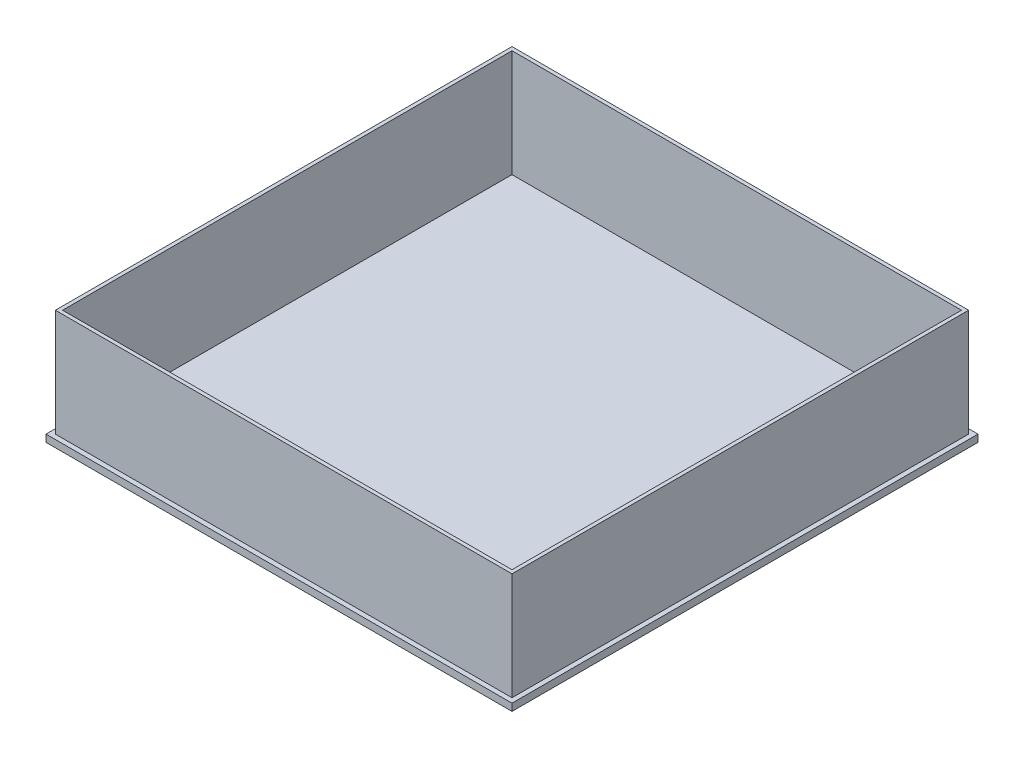
ISO-10303-21;
HEADER;
FILE_DESCRIPTION(('STEP AP214'),'2;1');
FILE_NAME('part.step','',(''),(''),'','','');
FILE_SCHEMA(('AUTOMOTIVE_DESIGN { 1 0 10303 214 1 1 1 1 }'));
ENDSEC;
DATA;
#1=APPLICATION_CONTEXT('core data for automotive mechanical design processes');
#2=APPLICATION_PROTOCOL_DEFINITION('international standard','automotive_design',2000,#1);
#3=PRODUCT_CONTEXT('',#1,'mechanical');
#4=PRODUCT('Part','Part','',(#3));
#5=PRODUCT_RELATED_PRODUCT_CATEGORY('part','',(#4));
#6=PRODUCT_DEFINITION_FORMATION('','',#4);
#7=PRODUCT_DEFINITION_CONTEXT('part definition',#1,'design');
#8=PRODUCT_DEFINITION('design','',#6,#7);
#9=PRODUCT_DEFINITION_SHAPE('','',#8);
#10=(LENGTH_UNIT() NAMED_UNIT(*) SI_UNIT(.MILLI.,.METRE.));
#11=(NAMED_UNIT(*) PLANE_ANGLE_UNIT() SI_UNIT($,.RADIAN.));
#12=(NAMED_UNIT(*) SI_UNIT($,.STERADIAN.) SOLID_ANGLE_UNIT());
#13=UNCERTAINTY_MEASURE_WITH_UNIT(LENGTH_MEASURE(1.E-05),#10,'distance_accuracy_value','');
#14=(GEOMETRIC_REPRESENTATION_CONTEXT(3) GLOBAL_UNCERTAINTY_ASSIGNED_CONTEXT((#13)) GLOBAL_UNIT_ASSIGNED_CONTEXT((#10,
#11,#12)) REPRESENTATION_CONTEXT('',''));
#15=CARTESIAN_POINT('',(0.,0.,0.));
#16=DIRECTION('',(0.,0.,1.));
#17=DIRECTION('',(1.,0.,0.));
#18=AXIS2_PLACEMENT_3D('',#15,#16,#17);
#19=CARTESIAN_POINT('',(0.,2.,0.));
#20=DIRECTION('',(0.,1.,0.));
#21=DIRECTION('',(0.,0.,1.));
#22=AXIS2_PLACEMENT_3D('',#19,#20,#21);
#23=PLANE('',#22);
#24=DIRECTION('',(0.,0.,1.));
#25=VECTOR('',#24,1.);
#26=CARTESIAN_POINT('',(-65.135852994836,2.,65.1358529948359));
#27=LINE('',#26,#25);
#28=CARTESIAN_POINT('',(-65.135852994836,2.,-65.1358529948359));
#29=VERTEX_POINT('',#28);
#30=CARTESIAN_POINT('',(-65.135852994836,2.,65.1358529948359));
#31=VERTEX_POINT('',#30);
#32=EDGE_CURVE('E190',#29,#31,#27,.T.);
#33=ORIENTED_EDGE('',*,*,#32,.T.);
#34=DIRECTION('',(1.,0.,0.));
#35=VECTOR('',#34,1.);
#36=CARTESIAN_POINT('',(65.135852994836,2.,65.1358529948359));
#37=LINE('',#36,#35);
#38=CARTESIAN_POINT('',(65.135852994836,2.,65.1358529948359));
#39=VERTEX_POINT('',#38);
#40=EDGE_CURVE('E193',#31,#39,#37,.T.);
#41=ORIENTED_EDGE('',*,*,#40,.T.);
#42=DIRECTION('',(0.,0.,-1.));
#43=VECTOR('',#42,1.);
#44=CARTESIAN_POINT('',(65.135852994836,2.,65.1358529948359));
#45=LINE('',#44,#43);
#46=CARTESIAN_POINT('',(65.135852994836,2.,-65.1358529948359));
#47=VERTEX_POINT('',#46);
#48=EDGE_CURVE('E196',#39,#47,#45,.T.);
#49=ORIENTED_EDGE('',*,*,#48,.T.);
#50=DIRECTION('',(-1.,0.,0.));
#51=VECTOR('',#50,1.);
#52=CARTESIAN_POINT('',(65.135852994836,2.,-65.1358529948359));
#53=LINE('',#52,#51);
#54=EDGE_CURVE('E198',#47,#29,#53,.T.);
#55=ORIENTED_EDGE('',*,*,#54,.T.);
#56=EDGE_LOOP('',(#33,#41,#49,#55));
#57=FACE_BOUND('',#56,.T.);
#58=DIRECTION('',(-1.,0.,0.));
#59=VECTOR('',#58,1.);
#60=CARTESIAN_POINT('',(-63.8241885978652,2.,-63.8241885978652));
#61=LINE('',#60,#59);
#62=CARTESIAN_POINT('',(63.8241885978652,2.,-63.8241885978652));
#63=VERTEX_POINT('',#62);
#64=CARTESIAN_POINT('',(-63.8241885978652,2.,-63.8241885978652));
#65=VERTEX_POINT('',#64);
#66=EDGE_CURVE('E176',#63,#65,#61,.T.);
#67=ORIENTED_EDGE('',*,*,#66,.F.);
#68=DIRECTION('',(0.,0.,-1.));
#69=VECTOR('',#68,1.);
#70=CARTESIAN_POINT('',(63.8241885978652,2.,63.8241885978652));
#71=LINE('',#70,#69);
#72=CARTESIAN_POINT('',(63.8241885978652,2.,63.8241885978652));
#73=VERTEX_POINT('',#72);
#74=EDGE_CURVE('E141',#73,#63,#71,.T.);
#75=ORIENTED_EDGE('',*,*,#74,.F.);
#76=DIRECTION('',(1.,0.,0.));
#77=VECTOR('',#76,1.);
#78=CARTESIAN_POINT('',(-63.8241885978652,2.,63.8241885978652));
#79=LINE('',#78,#77);
#80=CARTESIAN_POINT('',(-63.8241885978652,2.,63.8241885978652));
#81=VERTEX_POINT('',#80);
#82=EDGE_CURVE('E167',#81,#73,#79,.T.);
#83=ORIENTED_EDGE('',*,*,#82,.F.);
#84=DIRECTION('',(0.,0.,1.));
#85=VECTOR('',#84,1.);
#86=CARTESIAN_POINT('',(-63.8241885978652,2.,63.8241885978652));
#87=LINE('',#86,#85);
#88=EDGE_CURVE('E178',#65,#81,#87,.T.);
#89=ORIENTED_EDGE('',*,*,#88,.F.);
#90=EDGE_LOOP('',(#67,#75,#83,#89));
#91=FACE_BOUND('',#90,.T.);
#92=ADVANCED_FACE('F33',(#57,#91),#23,.T.);
#93=CARTESIAN_POINT('',(-65.135852994836,2.,65.1358529948359));
#94=DIRECTION('',(1.,0.,0.));
#95=DIRECTION('',(0.,0.,-1.));
#96=AXIS2_PLACEMENT_3D('',#93,#94,#95);
#97=PLANE('',#96);
#98=DIRECTION('',(0.,0.,1.));
#99=VECTOR('',#98,1.);
#100=CARTESIAN_POINT('',(-65.135852994836,0.,65.1358529948359));
#101=LINE('',#100,#99);
#102=CARTESIAN_POINT('',(-65.135852994836,0.,-65.1358529948359));
#103=VERTEX_POINT('',#102);
#104=CARTESIAN_POINT('',(-65.135852994836,0.,65.1358529948359));
#105=VERTEX_POINT('',#104);
#106=EDGE_CURVE('E189',#103,#105,#101,.T.);
#107=ORIENTED_EDGE('',*,*,#106,.T.);
#108=DIRECTION('',(0.,-1.,0.));
#109=VECTOR('',#108,1.);
#110=CARTESIAN_POINT('',(-65.135852994836,2.,65.1358529948359));
#111=LINE('',#110,#109);
#112=EDGE_CURVE('E11',#31,#105,#111,.T.);
#113=ORIENTED_EDGE('',*,*,#112,.F.);
#114=ORIENTED_EDGE('',*,*,#32,.F.);
#115=DIRECTION('',(0.,-1.,0.));
#116=VECTOR('',#115,1.);
#117=CARTESIAN_POINT('',(-65.135852994836,2.,-65.1358529948359));
#118=LINE('',#117,#116);
#119=EDGE_CURVE('E200',#29,#103,#118,.T.);
#120=ORIENTED_EDGE('',*,*,#119,.T.);
#121=EDGE_LOOP('',(#107,#113,#114,#120));
#122=FACE_BOUND('',#121,.T.);
#123=ADVANCED_FACE('F35',(#122),#97,.F.);
#124=CARTESIAN_POINT('',(65.135852994836,2.,65.1358529948359));
#125=DIRECTION('',(0.,0.,-1.));
#126=DIRECTION('',(-1.,0.,0.));
#127=AXIS2_PLACEMENT_3D('',#124,#125,#126);
#128=PLANE('',#127);
#129=DIRECTION('',(1.,0.,0.));
#130=VECTOR('',#129,1.);
#131=CARTESIAN_POINT('',(65.135852994836,0.,65.1358529948359));
#132=LINE('',#131,#130);
#133=CARTESIAN_POINT('',(65.135852994836,0.,65.1358529948359));
#134=VERTEX_POINT('',#133);
#135=EDGE_CURVE('E203',#105,#134,#132,.T.);
#136=ORIENTED_EDGE('',*,*,#135,.T.);
#137=DIRECTION('',(0.,-1.,0.));
#138=VECTOR('',#137,1.);
#139=CARTESIAN_POINT('',(65.135852994836,2.,65.1358529948359));
#140=LINE('',#139,#138);
#141=EDGE_CURVE('E41',#39,#134,#140,.T.);
#142=ORIENTED_EDGE('',*,*,#141,.F.);
#143=ORIENTED_EDGE('',*,*,#40,.F.);
#144=ORIENTED_EDGE('',*,*,#112,.T.);
#145=EDGE_LOOP('',(#136,#142,#143,#144));
#146=FACE_BOUND('',#145,.T.);
#147=ADVANCED_FACE('F233',(#146),#128,.F.);
#148=CARTESIAN_POINT('',(65.135852994836,2.,65.1358529948359));
#149=DIRECTION('',(-1.,0.,0.));
#150=DIRECTION('',(0.,0.,1.));
#151=AXIS2_PLACEMENT_3D('',#148,#149,#150);
#152=PLANE('',#151);
#153=DIRECTION('',(0.,0.,-1.));
#154=VECTOR('',#153,1.);
#155=CARTESIAN_POINT('',(65.135852994836,0.,65.1358529948359));
#156=LINE('',#155,#154);
#157=CARTESIAN_POINT('',(65.135852994836,0.,-65.1358529948359));
#158=VERTEX_POINT('',#157);
#159=EDGE_CURVE('E205',#134,#158,#156,.T.);
#160=ORIENTED_EDGE('',*,*,#159,.T.);
#161=DIRECTION('',(0.,-1.,0.));
#162=VECTOR('',#161,1.);
#163=CARTESIAN_POINT('',(65.135852994836,2.,-65.1358529948359));
#164=LINE('',#163,#162);
#165=EDGE_CURVE('E210',#47,#158,#164,.T.);
#166=ORIENTED_EDGE('',*,*,#165,.F.);
#167=ORIENTED_EDGE('',*,*,#48,.F.);
#168=ORIENTED_EDGE('',*,*,#141,.T.);
#169=EDGE_LOOP('',(#160,#166,#167,#168));
#170=FACE_BOUND('',#169,.T.);
#171=ADVANCED_FACE('F217',(#170),#152,.F.);
#172=CARTESIAN_POINT('',(65.135852994836,2.,-65.1358529948359));
#173=DIRECTION('',(0.,0.,1.));
#174=DIRECTION('',(1.,0.,0.));
#175=AXIS2_PLACEMENT_3D('',#172,#173,#174);
#176=PLANE('',#175);
#177=DIRECTION('',(-1.,0.,0.));
#178=VECTOR('',#177,1.);
#179=CARTESIAN_POINT('',(65.135852994836,0.,-65.1358529948359));
#180=LINE('',#179,#178);
#181=EDGE_CURVE('E194',#158,#103,#180,.T.);
#182=ORIENTED_EDGE('',*,*,#181,.T.);
#183=ORIENTED_EDGE('',*,*,#119,.F.);
#184=ORIENTED_EDGE('',*,*,#54,.F.);
#185=ORIENTED_EDGE('',*,*,#165,.T.);
#186=EDGE_LOOP('',(#182,#183,#184,#185));
#187=FACE_BOUND('',#186,.T.);
#188=ADVANCED_FACE('F226',(#187),#176,.F.);
#189=CARTESIAN_POINT('',(0.,0.,0.));
#190=DIRECTION('',(0.,1.,0.));
#191=DIRECTION('',(0.,0.,1.));
#192=AXIS2_PLACEMENT_3D('',#189,#190,#191);
#193=PLANE('',#192);
#194=ORIENTED_EDGE('',*,*,#106,.F.);
#195=ORIENTED_EDGE('',*,*,#181,.F.);
#196=ORIENTED_EDGE('',*,*,#159,.F.);
#197=ORIENTED_EDGE('',*,*,#135,.F.);
#198=EDGE_LOOP('',(#194,#195,#196,#197));
#199=FACE_BOUND('',#198,.T.);
#200=ADVANCED_FACE('F223',(#199),#193,.F.);
#201=CARTESIAN_POINT('',(0.,32.,0.));
#202=DIRECTION('',(0.,-1.,0.));
#203=DIRECTION('',(0.,0.,-1.));
#204=AXIS2_PLACEMENT_3D('',#201,#202,#203);
#205=PLANE('',#204);
#206=DIRECTION('',(0.,0.,-1.));
#207=VECTOR('',#206,1.);
#208=CARTESIAN_POINT('',(63.8241885978652,32.,63.8241885978652));
#209=LINE('',#208,#207);
#210=CARTESIAN_POINT('',(63.8241885978652,32.,63.8241885978652));
#211=VERTEX_POINT('',#210);
#212=CARTESIAN_POINT('',(63.8241885978652,32.,-63.8241885978652));
#213=VERTEX_POINT('',#212);
#214=EDGE_CURVE('E163',#211,#213,#209,.T.);
#215=ORIENTED_EDGE('',*,*,#214,.T.);
#216=DIRECTION('',(-1.,0.,0.));
#217=VECTOR('',#216,1.);
#218=CARTESIAN_POINT('',(-63.8241885978652,32.,-63.8241885978652));
#219=LINE('',#218,#217);
#220=CARTESIAN_POINT('',(-63.8241885978652,32.,-63.8241885978652));
#221=VERTEX_POINT('',#220);
#222=EDGE_CURVE('E166',#213,#221,#219,.T.);
#223=ORIENTED_EDGE('',*,*,#222,.T.);
#224=DIRECTION('',(0.,0.,1.));
#225=VECTOR('',#224,1.);
#226=CARTESIAN_POINT('',(-63.8241885978652,32.,63.8241885978652));
#227=LINE('',#226,#225);
#228=CARTESIAN_POINT('',(-63.8241885978652,32.,63.8241885978652));
#229=VERTEX_POINT('',#228);
#230=EDGE_CURVE('E169',#221,#229,#227,.T.);
#231=ORIENTED_EDGE('',*,*,#230,.T.);
#232=DIRECTION('',(1.,0.,0.));
#233=VECTOR('',#232,1.);
#234=CARTESIAN_POINT('',(-63.8241885978652,32.,63.8241885978652));
#235=LINE('',#234,#233);
#236=EDGE_CURVE('E171',#229,#211,#235,.T.);
#237=ORIENTED_EDGE('',*,*,#236,.T.);
#238=EDGE_LOOP('',(#215,#223,#231,#237));
#239=FACE_BOUND('',#238,.T.);
#240=DIRECTION('',(0.,0.,1.));
#241=VECTOR('',#240,1.);
#242=CARTESIAN_POINT('',(-62.8241885978652,32.,62.8241885978652));
#243=LINE('',#242,#241);
#244=CARTESIAN_POINT('',(-62.8241885978652,32.,-62.8241885978652));
#245=VERTEX_POINT('',#244);
#246=CARTESIAN_POINT('',(-62.8241885978652,32.,62.8241885978652));
#247=VERTEX_POINT('',#246);
#248=EDGE_CURVE('E124',#245,#247,#243,.T.);
#249=ORIENTED_EDGE('',*,*,#248,.F.);
#250=DIRECTION('',(-1.,0.,0.));
#251=VECTOR('',#250,1.);
#252=CARTESIAN_POINT('',(-62.8241885978652,32.,-62.8241885978652));
#253=LINE('',#252,#251);
#254=CARTESIAN_POINT('',(62.8241885978652,32.,-62.8241885978652));
#255=VERTEX_POINT('',#254);
#256=EDGE_CURVE('E149',#255,#245,#253,.T.);
#257=ORIENTED_EDGE('',*,*,#256,.F.);
#258=DIRECTION('',(0.,0.,-1.));
#259=VECTOR('',#258,1.);
#260=CARTESIAN_POINT('',(62.8241885978652,32.,62.8241885978652));
#261=LINE('',#260,#259);
#262=CARTESIAN_POINT('',(62.8241885978652,32.,62.8241885978652));
#263=VERTEX_POINT('',#262);
#264=EDGE_CURVE('E147',#263,#255,#261,.T.);
#265=ORIENTED_EDGE('',*,*,#264,.F.);
#266=DIRECTION('',(1.,0.,0.));
#267=VECTOR('',#266,1.);
#268=CARTESIAN_POINT('',(-62.8241885978652,32.,62.8241885978652));
#269=LINE('',#268,#267);
#270=EDGE_CURVE('E133',#247,#263,#269,.T.);
#271=ORIENTED_EDGE('',*,*,#270,.F.);
#272=EDGE_LOOP('',(#249,#257,#265,#271));
#273=FACE_BOUND('',#272,.T.);
#274=ADVANCED_FACE('F145',(#239,#273),#205,.F.);
#275=CARTESIAN_POINT('',(63.8241885978652,32.,63.8241885978652));
#276=DIRECTION('',(-1.,0.,0.));
#277=DIRECTION('',(0.,0.,1.));
#278=AXIS2_PLACEMENT_3D('',#275,#276,#277);
#279=PLANE('',#278);
#280=ORIENTED_EDGE('',*,*,#74,.T.);
#281=DIRECTION('',(0.,-1.,0.));
#282=VECTOR('',#281,1.);
#283=CARTESIAN_POINT('',(63.8241885978652,32.,-63.8241885978652));
#284=LINE('',#283,#282);
#285=EDGE_CURVE('E187',#213,#63,#284,.T.);
#286=ORIENTED_EDGE('',*,*,#285,.F.);
#287=ORIENTED_EDGE('',*,*,#214,.F.);
#288=DIRECTION('',(0.,-1.,0.));
#289=VECTOR('',#288,1.);
#290=CARTESIAN_POINT('',(63.8241885978652,32.,63.8241885978652));
#291=LINE('',#290,#289);
#292=EDGE_CURVE('E173',#211,#73,#291,.T.);
#293=ORIENTED_EDGE('',*,*,#292,.T.);
#294=EDGE_LOOP('',(#280,#286,#287,#293));
#295=FACE_BOUND('',#294,.T.);
#296=ADVANCED_FACE('F269',(#295),#279,.F.);
#297=CARTESIAN_POINT('',(-63.8241885978652,32.,-63.8241885978652));
#298=DIRECTION('',(0.,0.,1.));
#299=DIRECTION('',(1.,0.,0.));
#300=AXIS2_PLACEMENT_3D('',#297,#298,#299);
#301=PLANE('',#300);
#302=ORIENTED_EDGE('',*,*,#66,.T.);
#303=DIRECTION('',(0.,-1.,0.));
#304=VECTOR('',#303,1.);
#305=CARTESIAN_POINT('',(-63.8241885978652,32.,-63.8241885978652));
#306=LINE('',#305,#304);
#307=EDGE_CURVE('E184',#221,#65,#306,.T.);
#308=ORIENTED_EDGE('',*,*,#307,.F.);
#309=ORIENTED_EDGE('',*,*,#222,.F.);
#310=ORIENTED_EDGE('',*,*,#285,.T.);
#311=EDGE_LOOP('',(#302,#308,#309,#310));
#312=FACE_BOUND('',#311,.T.);
#313=ADVANCED_FACE('F276',(#312),#301,.F.);
#314=CARTESIAN_POINT('',(-63.8241885978652,32.,63.8241885978652));
#315=DIRECTION('',(1.,0.,0.));
#316=DIRECTION('',(0.,0.,-1.));
#317=AXIS2_PLACEMENT_3D('',#314,#315,#316);
#318=PLANE('',#317);
#319=ORIENTED_EDGE('',*,*,#88,.T.);
#320=DIRECTION('',(0.,-1.,0.));
#321=VECTOR('',#320,1.);
#322=CARTESIAN_POINT('',(-63.8241885978652,32.,63.8241885978652));
#323=LINE('',#322,#321);
#324=EDGE_CURVE('E48',#229,#81,#323,.T.);
#325=ORIENTED_EDGE('',*,*,#324,.F.);
#326=ORIENTED_EDGE('',*,*,#230,.F.);
#327=ORIENTED_EDGE('',*,*,#307,.T.);
#328=EDGE_LOOP('',(#319,#325,#326,#327));
#329=FACE_BOUND('',#328,.T.);
#330=ADVANCED_FACE('F273',(#329),#318,.F.);
#331=CARTESIAN_POINT('',(-63.8241885978652,32.,63.8241885978652));
#332=DIRECTION('',(0.,0.,-1.));
#333=DIRECTION('',(-1.,0.,0.));
#334=AXIS2_PLACEMENT_3D('',#331,#332,#333);
#335=PLANE('',#334);
#336=ORIENTED_EDGE('',*,*,#82,.T.);
#337=ORIENTED_EDGE('',*,*,#292,.F.);
#338=ORIENTED_EDGE('',*,*,#236,.F.);
#339=ORIENTED_EDGE('',*,*,#324,.T.);
#340=EDGE_LOOP('',(#336,#337,#338,#339));
#341=FACE_BOUND('',#340,.T.);
#342=ADVANCED_FACE('F266',(#341),#335,.F.);
#343=CARTESIAN_POINT('',(-62.8241885978652,32.,62.8241885978652));
#344=DIRECTION('',(1.,0.,0.));
#345=DIRECTION('',(0.,0.,-1.));
#346=AXIS2_PLACEMENT_3D('',#343,#344,#345);
#347=PLANE('',#346);
#348=DIRECTION('',(0.,0.,1.));
#349=VECTOR('',#348,1.);
#350=CARTESIAN_POINT('',(-62.8241885978652,2.,62.8241885978652));
#351=LINE('',#350,#349);
#352=CARTESIAN_POINT('',(-62.8241885978652,2.,-62.8241885978652));
#353=VERTEX_POINT('',#352);
#354=CARTESIAN_POINT('',(-62.8241885978652,2.,62.8241885978652));
#355=VERTEX_POINT('',#354);
#356=EDGE_CURVE('E56',#353,#355,#351,.T.);
#357=ORIENTED_EDGE('',*,*,#356,.F.);
#358=DIRECTION('',(0.,-1.,0.));
#359=VECTOR('',#358,1.);
#360=CARTESIAN_POINT('',(-62.8241885978652,32.,-62.8241885978652));
#361=LINE('',#360,#359);
#362=EDGE_CURVE('E129',#245,#353,#361,.T.);
#363=ORIENTED_EDGE('',*,*,#362,.F.);
#364=ORIENTED_EDGE('',*,*,#248,.T.);
#365=DIRECTION('',(0.,-1.,0.));
#366=VECTOR('',#365,1.);
#367=CARTESIAN_POINT('',(-62.8241885978652,32.,62.8241885978652));
#368=LINE('',#367,#366);
#369=EDGE_CURVE('E127',#247,#355,#368,.T.);
#370=ORIENTED_EDGE('',*,*,#369,.T.);
#371=EDGE_LOOP('',(#357,#363,#364,#370));
#372=FACE_BOUND('',#371,.T.);
#373=ADVANCED_FACE('F126',(#372),#347,.T.);
#374=CARTESIAN_POINT('',(-62.8241885978652,32.,62.8241885978652));
#375=DIRECTION('',(0.,0.,-1.));
#376=DIRECTION('',(-1.,0.,0.));
#377=AXIS2_PLACEMENT_3D('',#374,#375,#376);
#378=PLANE('',#377);
#379=DIRECTION('',(1.,0.,0.));
#380=VECTOR('',#379,1.);
#381=CARTESIAN_POINT('',(-62.8241885978652,2.,62.8241885978652));
#382=LINE('',#381,#380);
#383=CARTESIAN_POINT('',(62.8241885978652,2.,62.8241885978652));
#384=VERTEX_POINT('',#383);
#385=EDGE_CURVE('E140',#355,#384,#382,.T.);
#386=ORIENTED_EDGE('',*,*,#385,.F.);
#387=ORIENTED_EDGE('',*,*,#369,.F.);
#388=ORIENTED_EDGE('',*,*,#270,.T.);
#389=DIRECTION('',(0.,-1.,0.));
#390=VECTOR('',#389,1.);
#391=CARTESIAN_POINT('',(62.8241885978652,32.,62.8241885978652));
#392=LINE('',#391,#390);
#393=EDGE_CURVE('E142',#263,#384,#392,.T.);
#394=ORIENTED_EDGE('',*,*,#393,.T.);
#395=EDGE_LOOP('',(#386,#387,#388,#394));
#396=FACE_BOUND('',#395,.T.);
#397=ADVANCED_FACE('F137',(#396),#378,.T.);
#398=CARTESIAN_POINT('',(62.8241885978652,32.,62.8241885978652));
#399=DIRECTION('',(-1.,0.,0.));
#400=DIRECTION('',(0.,0.,1.));
#401=AXIS2_PLACEMENT_3D('',#398,#399,#400);
#402=PLANE('',#401);
#403=DIRECTION('',(0.,0.,-1.));
#404=VECTOR('',#403,1.);
#405=CARTESIAN_POINT('',(62.8241885978652,2.,62.8241885978652));
#406=LINE('',#405,#404);
#407=CARTESIAN_POINT('',(62.8241885978652,2.,-62.8241885978652));
#408=VERTEX_POINT('',#407);
#409=EDGE_CURVE('E155',#384,#408,#406,.T.);
#410=ORIENTED_EDGE('',*,*,#409,.F.);
#411=ORIENTED_EDGE('',*,*,#393,.F.);
#412=ORIENTED_EDGE('',*,*,#264,.T.);
#413=DIRECTION('',(0.,-1.,0.));
#414=VECTOR('',#413,1.);
#415=CARTESIAN_POINT('',(62.8241885978652,32.,-62.8241885978652));
#416=LINE('',#415,#414);
#417=EDGE_CURVE('E159',#255,#408,#416,.T.);
#418=ORIENTED_EDGE('',*,*,#417,.T.);
#419=EDGE_LOOP('',(#410,#411,#412,#418));
#420=FACE_BOUND('',#419,.T.);
#421=ADVANCED_FACE('F252',(#420),#402,.T.);
#422=CARTESIAN_POINT('',(-62.8241885978652,32.,-62.8241885978652));
#423=DIRECTION('',(0.,0.,1.));
#424=DIRECTION('',(1.,0.,0.));
#425=AXIS2_PLACEMENT_3D('',#422,#423,#424);
#426=PLANE('',#425);
#427=DIRECTION('',(-1.,0.,0.));
#428=VECTOR('',#427,1.);
#429=CARTESIAN_POINT('',(-62.8241885978652,2.,-62.8241885978652));
#430=LINE('',#429,#428);
#431=EDGE_CURVE('E134',#408,#353,#430,.T.);
#432=ORIENTED_EDGE('',*,*,#431,.F.);
#433=ORIENTED_EDGE('',*,*,#417,.F.);
#434=ORIENTED_EDGE('',*,*,#256,.T.);
#435=ORIENTED_EDGE('',*,*,#362,.T.);
#436=EDGE_LOOP('',(#432,#433,#434,#435));
#437=FACE_BOUND('',#436,.T.);
#438=ADVANCED_FACE('F248',(#437),#426,.T.);
#439=ORIENTED_EDGE('',*,*,#356,.T.);
#440=ORIENTED_EDGE('',*,*,#385,.T.);
#441=ORIENTED_EDGE('',*,*,#409,.T.);
#442=ORIENTED_EDGE('',*,*,#431,.T.);
#443=EDGE_LOOP('',(#439,#440,#441,#442));
#444=FACE_BOUND('',#443,.T.);
#445=ADVANCED_FACE('F242',(#444),#23,.T.);
#446=CLOSED_SHELL('',(#92,#123,#147,#171,#188,#200,#274,#296,#313,#330,#342,#373,#397,#421,#438,#445));
#447=MANIFOLD_SOLID_BREP('B2',#446);
#448=ADVANCED_BREP_SHAPE_REPRESENTATION('',(#18,#447),#14);
#449=SHAPE_DEFINITION_REPRESENTATION(#9,#448);
ENDSEC;
END-ISO-10303-21;
